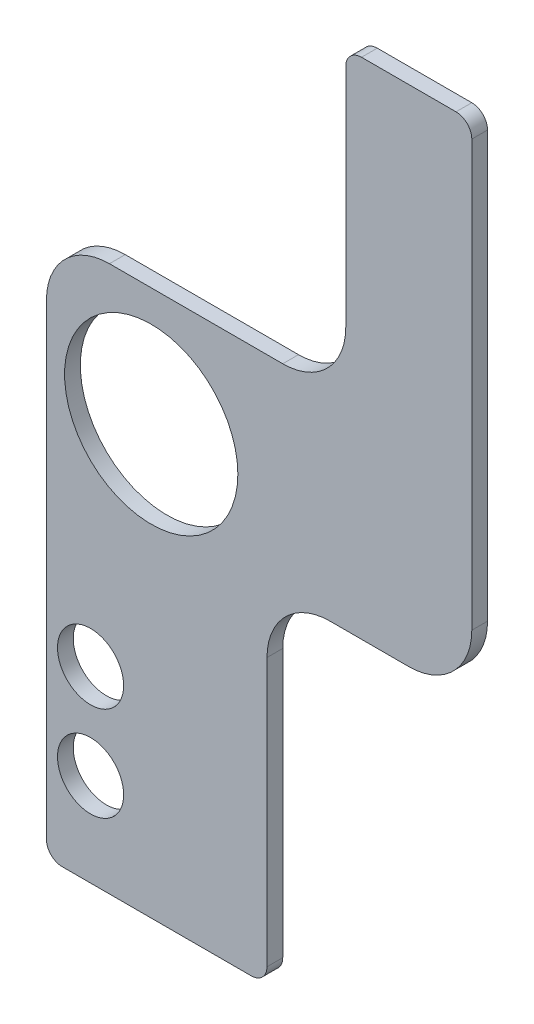
ISO-10303-21;
HEADER;
FILE_DESCRIPTION(('STEP AP214'),'2;1');
FILE_NAME('part.step','',(''),(''),'','','');
FILE_SCHEMA(('AUTOMOTIVE_DESIGN { 1 0 10303 214 1 1 1 1 }'));
ENDSEC;
DATA;
#1=APPLICATION_CONTEXT('core data for automotive mechanical design processes');
#2=APPLICATION_PROTOCOL_DEFINITION('international standard','automotive_design',2000,#1);
#3=PRODUCT_CONTEXT('',#1,'mechanical');
#4=PRODUCT('Part','Part','',(#3));
#5=PRODUCT_RELATED_PRODUCT_CATEGORY('part','',(#4));
#6=PRODUCT_DEFINITION_FORMATION('','',#4);
#7=PRODUCT_DEFINITION_CONTEXT('part definition',#1,'design');
#8=PRODUCT_DEFINITION('design','',#6,#7);
#9=PRODUCT_DEFINITION_SHAPE('','',#8);
#10=(LENGTH_UNIT() NAMED_UNIT(*) SI_UNIT(.MILLI.,.METRE.));
#11=(NAMED_UNIT(*) PLANE_ANGLE_UNIT() SI_UNIT($,.RADIAN.));
#12=(NAMED_UNIT(*) SI_UNIT($,.STERADIAN.) SOLID_ANGLE_UNIT());
#13=UNCERTAINTY_MEASURE_WITH_UNIT(LENGTH_MEASURE(1.E-05),#10,'distance_accuracy_value','');
#14=(GEOMETRIC_REPRESENTATION_CONTEXT(3) GLOBAL_UNCERTAINTY_ASSIGNED_CONTEXT((#13)) GLOBAL_UNIT_ASSIGNED_CONTEXT((#10,
#11,#12)) REPRESENTATION_CONTEXT('',''));
#15=CARTESIAN_POINT('',(0.,0.,0.));
#16=DIRECTION('',(0.,0.,1.));
#17=DIRECTION('',(1.,0.,0.));
#18=AXIS2_PLACEMENT_3D('',#15,#16,#17);
#19=CARTESIAN_POINT('',(9.82320597506649,3.51150326143931,1.));
#20=DIRECTION('',(0.,0.,1.));
#21=DIRECTION('',(1.,0.,0.));
#22=AXIS2_PLACEMENT_3D('',#19,#20,#21);
#23=PLANE('',#22);
#24=CARTESIAN_POINT('',(-10.3767940249335,-10.5884967385607,1.));
#25=DIRECTION('',(0.,0.,1.));
#26=DIRECTION('',(1.,0.,0.));
#27=AXIS2_PLACEMENT_3D('',#24,#25,#26);
#28=CIRCLE('',#27,2.1);
#29=CARTESIAN_POINT('',(-8.2767940249335,-10.5884967385607,1.));
#30=VERTEX_POINT('',#29);
#31=EDGE_CURVE('E344',#30,#30,#28,.T.);
#32=ORIENTED_EDGE('',*,*,#31,.F.);
#33=EDGE_LOOP('',(#32));
#34=FACE_BOUND('',#33,.T.);
#35=CARTESIAN_POINT('',(9.82320597506649,3.51150326143931,1.));
#36=DIRECTION('',(0.,0.,1.));
#37=DIRECTION('',(1.,0.,0.));
#38=AXIS2_PLACEMENT_3D('',#35,#36,#37);
#39=CIRCLE('',#38,4.);
#40=CARTESIAN_POINT('',(9.82320597506649,-0.488496738560686,1.));
#41=VERTEX_POINT('',#40);
#42=CARTESIAN_POINT('',(13.8232059750665,3.51150326143931,1.));
#43=VERTEX_POINT('',#42);
#44=EDGE_CURVE('E215',#41,#43,#39,.T.);
#45=ORIENTED_EDGE('',*,*,#44,.T.);
#46=DIRECTION('',(0.,1.,0.));
#47=VECTOR('',#46,1.);
#48=CARTESIAN_POINT('',(13.8232059750665,3.51150326143931,1.));
#49=LINE('',#48,#47);
#50=CARTESIAN_POINT('',(13.8232059750665,30.5115032614393,1.));
#51=VERTEX_POINT('',#50);
#52=EDGE_CURVE('E123',#43,#51,#49,.T.);
#53=ORIENTED_EDGE('',*,*,#52,.T.);
#54=CARTESIAN_POINT('',(12.8232059750665,30.5115032614393,1.));
#55=DIRECTION('',(0.,0.,1.));
#56=DIRECTION('',(1.,0.,0.));
#57=AXIS2_PLACEMENT_3D('',#54,#55,#56);
#58=CIRCLE('',#57,0.999999999999997);
#59=CARTESIAN_POINT('',(12.8232059750665,31.5115032614393,1.));
#60=VERTEX_POINT('',#59);
#61=EDGE_CURVE('E254',#51,#60,#58,.T.);
#62=ORIENTED_EDGE('',*,*,#61,.T.);
#63=DIRECTION('',(-1.,0.,0.));
#64=VECTOR('',#63,1.);
#65=CARTESIAN_POINT('',(6.82320597506649,31.5115032614393,1.));
#66=LINE('',#65,#64);
#67=CARTESIAN_POINT('',(6.82320597506649,31.5115032614393,1.));
#68=VERTEX_POINT('',#67);
#69=EDGE_CURVE('E273',#60,#68,#66,.T.);
#70=ORIENTED_EDGE('',*,*,#69,.T.);
#71=CARTESIAN_POINT('',(6.82320597506649,30.5115032614393,1.));
#72=DIRECTION('',(0.,0.,1.));
#73=DIRECTION('',(1.,0.,0.));
#74=AXIS2_PLACEMENT_3D('',#71,#72,#73);
#75=CIRCLE('',#74,1.);
#76=CARTESIAN_POINT('',(5.82320597506649,30.5115032614393,1.));
#77=VERTEX_POINT('',#76);
#78=EDGE_CURVE('E270',#68,#77,#75,.T.);
#79=ORIENTED_EDGE('',*,*,#78,.T.);
#80=DIRECTION('',(0.,-1.,0.));
#81=VECTOR('',#80,1.);
#82=CARTESIAN_POINT('',(5.82320597506649,16.1615032614393,1.));
#83=LINE('',#82,#81);
#84=CARTESIAN_POINT('',(5.82320597506649,16.1615032614393,1.));
#85=VERTEX_POINT('',#84);
#86=EDGE_CURVE('E272',#77,#85,#83,.T.);
#87=ORIENTED_EDGE('',*,*,#86,.T.);
#88=CARTESIAN_POINT('',(1.82320597506649,16.1615032614393,1.));
#89=DIRECTION('',(0.,0.,-1.));
#90=DIRECTION('',(-1.,0.,0.));
#91=AXIS2_PLACEMENT_3D('',#88,#89,#90);
#92=CIRCLE('',#91,4.);
#93=CARTESIAN_POINT('',(1.82320597506649,12.1615032614393,1.));
#94=VERTEX_POINT('',#93);
#95=EDGE_CURVE('E275',#85,#94,#92,.T.);
#96=ORIENTED_EDGE('',*,*,#95,.T.);
#97=DIRECTION('',(-1.,0.,0.));
#98=VECTOR('',#97,1.);
#99=CARTESIAN_POINT('',(-9.17679402493351,12.1615032614393,1.));
#100=LINE('',#99,#98);
#101=CARTESIAN_POINT('',(-9.17679402493351,12.1615032614393,1.));
#102=VERTEX_POINT('',#101);
#103=EDGE_CURVE('E281',#94,#102,#100,.T.);
#104=ORIENTED_EDGE('',*,*,#103,.T.);
#105=CARTESIAN_POINT('',(-9.17679402493351,8.16150326143931,1.));
#106=DIRECTION('',(0.,0.,1.));
#107=DIRECTION('',(-1.,0.,0.));
#108=AXIS2_PLACEMENT_3D('',#105,#106,#107);
#109=CIRCLE('',#108,4.);
#110=CARTESIAN_POINT('',(-13.1767940249335,8.16150326143931,1.));
#111=VERTEX_POINT('',#110);
#112=EDGE_CURVE('E283',#102,#111,#109,.T.);
#113=ORIENTED_EDGE('',*,*,#112,.T.);
#114=DIRECTION('',(0.,-1.,0.));
#115=VECTOR('',#114,1.);
#116=CARTESIAN_POINT('',(-13.1767940249335,-21.4884967385607,1.));
#117=LINE('',#116,#115);
#118=CARTESIAN_POINT('',(-13.1767940249335,-21.4884967385607,1.));
#119=VERTEX_POINT('',#118);
#120=EDGE_CURVE('E285',#111,#119,#117,.T.);
#121=ORIENTED_EDGE('',*,*,#120,.T.);
#122=CARTESIAN_POINT('',(-12.1767940249335,-21.4884967385607,1.));
#123=DIRECTION('',(0.,0.,1.));
#124=DIRECTION('',(-1.,0.,0.));
#125=AXIS2_PLACEMENT_3D('',#122,#123,#124);
#126=CIRCLE('',#125,1.);
#127=CARTESIAN_POINT('',(-12.1767940249335,-22.4884967385607,1.));
#128=VERTEX_POINT('',#127);
#129=EDGE_CURVE('E287',#119,#128,#126,.T.);
#130=ORIENTED_EDGE('',*,*,#129,.T.);
#131=DIRECTION('',(1.,0.,0.));
#132=VECTOR('',#131,1.);
#133=CARTESIAN_POINT('',(-12.1767940249335,-22.4884967385607,1.));
#134=LINE('',#133,#132);
#135=CARTESIAN_POINT('',(-0.176794024933504,-22.4884967385607,1.));
#136=VERTEX_POINT('',#135);
#137=EDGE_CURVE('E289',#128,#136,#134,.T.);
#138=ORIENTED_EDGE('',*,*,#137,.T.);
#139=CARTESIAN_POINT('',(-0.176794024933504,-21.4884967385607,1.));
#140=DIRECTION('',(0.,0.,1.));
#141=DIRECTION('',(-1.,0.,0.));
#142=AXIS2_PLACEMENT_3D('',#139,#140,#141);
#143=CIRCLE('',#142,1.);
#144=CARTESIAN_POINT('',(0.823205975066495,-21.4884967385607,1.));
#145=VERTEX_POINT('',#144);
#146=EDGE_CURVE('E166',#136,#145,#143,.T.);
#147=ORIENTED_EDGE('',*,*,#146,.T.);
#148=DIRECTION('',(0.,1.,0.));
#149=VECTOR('',#148,1.);
#150=CARTESIAN_POINT('',(0.823205975066495,-21.4884967385607,1.));
#151=LINE('',#150,#149);
#152=CARTESIAN_POINT('',(0.823205975066495,-4.48849673856069,1.));
#153=VERTEX_POINT('',#152);
#154=EDGE_CURVE('E160',#145,#153,#151,.T.);
#155=ORIENTED_EDGE('',*,*,#154,.T.);
#156=CARTESIAN_POINT('',(4.82320597506649,-4.48849673856069,1.));
#157=DIRECTION('',(0.,0.,-1.));
#158=DIRECTION('',(-1.,0.,0.));
#159=AXIS2_PLACEMENT_3D('',#156,#157,#158);
#160=CIRCLE('',#159,4.);
#161=CARTESIAN_POINT('',(4.82320597506649,-0.488496738560686,1.));
#162=VERTEX_POINT('',#161);
#163=EDGE_CURVE('E164',#153,#162,#160,.T.);
#164=ORIENTED_EDGE('',*,*,#163,.T.);
#165=DIRECTION('',(1.,0.,0.));
#166=VECTOR('',#165,1.);
#167=CARTESIAN_POINT('',(4.82320597506649,-0.488496738560686,1.));
#168=LINE('',#167,#166);
#169=EDGE_CURVE('E56',#162,#41,#168,.T.);
#170=ORIENTED_EDGE('',*,*,#169,.T.);
#171=EDGE_LOOP('',(#45,#53,#62,#70,#79,#87,#96,#104,#113,#121,#130,#138,#147,#155,#164,#170));
#172=FACE_BOUND('',#171,.T.);
#173=CARTESIAN_POINT('',(-10.3767940249335,-16.5884967385607,1.));
#174=DIRECTION('',(0.,0.,1.));
#175=DIRECTION('',(1.,0.,0.));
#176=AXIS2_PLACEMENT_3D('',#173,#174,#175);
#177=CIRCLE('',#176,2.1);
#178=CARTESIAN_POINT('',(-8.2767940249335,-16.5884967385607,1.));
#179=VERTEX_POINT('',#178);
#180=EDGE_CURVE('E188',#179,#179,#177,.T.);
#181=ORIENTED_EDGE('',*,*,#180,.F.);
#182=EDGE_LOOP('',(#181));
#183=FACE_BOUND('',#182,.T.);
#184=CARTESIAN_POINT('',(-6.52679402493351,4.66150326143932,1.));
#185=DIRECTION('',(0.,0.,1.));
#186=DIRECTION('',(1.,0.,0.));
#187=AXIS2_PLACEMENT_3D('',#184,#185,#186);
#188=CIRCLE('',#187,5.5);
#189=CARTESIAN_POINT('',(-1.02679402493351,4.66150326143932,1.));
#190=VERTEX_POINT('',#189);
#191=EDGE_CURVE('E335',#190,#190,#188,.T.);
#192=ORIENTED_EDGE('',*,*,#191,.F.);
#193=EDGE_LOOP('',(#192));
#194=FACE_BOUND('',#193,.T.);
#195=ADVANCED_FACE('F39',(#34,#172,#183,#194),#23,.T.);
#196=CARTESIAN_POINT('',(9.82320597506649,3.51150326143931,0.));
#197=DIRECTION('',(0.,0.,1.));
#198=DIRECTION('',(1.,0.,0.));
#199=AXIS2_PLACEMENT_3D('',#196,#197,#198);
#200=PLANE('',#199);
#201=CARTESIAN_POINT('',(9.82320597506649,3.51150326143931,0.));
#202=DIRECTION('',(0.,0.,1.));
#203=DIRECTION('',(1.,0.,0.));
#204=AXIS2_PLACEMENT_3D('',#201,#202,#203);
#205=CIRCLE('',#204,4.);
#206=CARTESIAN_POINT('',(9.82320597506649,-0.488496738560686,0.));
#207=VERTEX_POINT('',#206);
#208=CARTESIAN_POINT('',(13.8232059750665,3.51150326143931,0.));
#209=VERTEX_POINT('',#208);
#210=EDGE_CURVE('E184',#207,#209,#205,.T.);
#211=ORIENTED_EDGE('',*,*,#210,.F.);
#212=DIRECTION('',(1.,0.,0.));
#213=VECTOR('',#212,1.);
#214=CARTESIAN_POINT('',(4.82320597506649,-0.488496738560686,0.));
#215=LINE('',#214,#213);
#216=CARTESIAN_POINT('',(4.82320597506649,-0.488496738560686,0.));
#217=VERTEX_POINT('',#216);
#218=EDGE_CURVE('E115',#217,#207,#215,.T.);
#219=ORIENTED_EDGE('',*,*,#218,.F.);
#220=CARTESIAN_POINT('',(4.82320597506649,-4.48849673856069,0.));
#221=DIRECTION('',(0.,0.,-1.));
#222=DIRECTION('',(-1.,0.,0.));
#223=AXIS2_PLACEMENT_3D('',#220,#221,#222);
#224=CIRCLE('',#223,4.);
#225=CARTESIAN_POINT('',(0.823205975066495,-4.48849673856069,0.));
#226=VERTEX_POINT('',#225);
#227=EDGE_CURVE('E109',#226,#217,#224,.T.);
#228=ORIENTED_EDGE('',*,*,#227,.F.);
#229=DIRECTION('',(0.,1.,0.));
#230=VECTOR('',#229,1.);
#231=CARTESIAN_POINT('',(0.823205975066495,-21.4884967385607,0.));
#232=LINE('',#231,#230);
#233=CARTESIAN_POINT('',(0.823205975066495,-21.4884967385607,0.));
#234=VERTEX_POINT('',#233);
#235=EDGE_CURVE('E174',#234,#226,#232,.T.);
#236=ORIENTED_EDGE('',*,*,#235,.F.);
#237=CARTESIAN_POINT('',(-0.176794024933504,-21.4884967385607,0.));
#238=DIRECTION('',(0.,0.,1.));
#239=DIRECTION('',(-1.,0.,0.));
#240=AXIS2_PLACEMENT_3D('',#237,#238,#239);
#241=CIRCLE('',#240,1.);
#242=CARTESIAN_POINT('',(-0.176794024933504,-22.4884967385607,0.));
#243=VERTEX_POINT('',#242);
#244=EDGE_CURVE('E210',#243,#234,#241,.T.);
#245=ORIENTED_EDGE('',*,*,#244,.F.);
#246=DIRECTION('',(1.,0.,0.));
#247=VECTOR('',#246,1.);
#248=CARTESIAN_POINT('',(-12.1767940249335,-22.4884967385607,0.));
#249=LINE('',#248,#247);
#250=CARTESIAN_POINT('',(-12.1767940249335,-22.4884967385607,0.));
#251=VERTEX_POINT('',#250);
#252=EDGE_CURVE('E208',#251,#243,#249,.T.);
#253=ORIENTED_EDGE('',*,*,#252,.F.);
#254=CARTESIAN_POINT('',(-12.1767940249335,-21.4884967385607,0.));
#255=DIRECTION('',(0.,0.,1.));
#256=DIRECTION('',(-1.,0.,0.));
#257=AXIS2_PLACEMENT_3D('',#254,#255,#256);
#258=CIRCLE('',#257,1.);
#259=CARTESIAN_POINT('',(-13.1767940249335,-21.4884967385607,0.));
#260=VERTEX_POINT('',#259);
#261=EDGE_CURVE('E206',#260,#251,#258,.T.);
#262=ORIENTED_EDGE('',*,*,#261,.F.);
#263=DIRECTION('',(0.,-1.,0.));
#264=VECTOR('',#263,1.);
#265=CARTESIAN_POINT('',(-13.1767940249335,-21.4884967385607,0.));
#266=LINE('',#265,#264);
#267=CARTESIAN_POINT('',(-13.1767940249335,8.16150326143931,0.));
#268=VERTEX_POINT('',#267);
#269=EDGE_CURVE('E204',#268,#260,#266,.T.);
#270=ORIENTED_EDGE('',*,*,#269,.F.);
#271=CARTESIAN_POINT('',(-9.17679402493351,8.16150326143931,0.));
#272=DIRECTION('',(0.,0.,1.));
#273=DIRECTION('',(-1.,0.,0.));
#274=AXIS2_PLACEMENT_3D('',#271,#272,#273);
#275=CIRCLE('',#274,4.);
#276=CARTESIAN_POINT('',(-9.17679402493351,12.1615032614393,0.));
#277=VERTEX_POINT('',#276);
#278=EDGE_CURVE('E202',#277,#268,#275,.T.);
#279=ORIENTED_EDGE('',*,*,#278,.F.);
#280=DIRECTION('',(-1.,0.,0.));
#281=VECTOR('',#280,1.);
#282=CARTESIAN_POINT('',(-9.17679402493351,12.1615032614393,0.));
#283=LINE('',#282,#281);
#284=CARTESIAN_POINT('',(1.82320597506649,12.1615032614393,0.));
#285=VERTEX_POINT('',#284);
#286=EDGE_CURVE('E200',#285,#277,#283,.T.);
#287=ORIENTED_EDGE('',*,*,#286,.F.);
#288=CARTESIAN_POINT('',(1.82320597506649,16.1615032614393,0.));
#289=DIRECTION('',(0.,0.,-1.));
#290=DIRECTION('',(-1.,0.,0.));
#291=AXIS2_PLACEMENT_3D('',#288,#289,#290);
#292=CIRCLE('',#291,4.);
#293=CARTESIAN_POINT('',(5.82320597506649,16.1615032614393,0.));
#294=VERTEX_POINT('',#293);
#295=EDGE_CURVE('E198',#294,#285,#292,.T.);
#296=ORIENTED_EDGE('',*,*,#295,.F.);
#297=DIRECTION('',(0.,-1.,0.));
#298=VECTOR('',#297,1.);
#299=CARTESIAN_POINT('',(5.82320597506649,16.1615032614393,0.));
#300=LINE('',#299,#298);
#301=CARTESIAN_POINT('',(5.82320597506649,30.5115032614393,0.));
#302=VERTEX_POINT('',#301);
#303=EDGE_CURVE('E196',#302,#294,#300,.T.);
#304=ORIENTED_EDGE('',*,*,#303,.F.);
#305=CARTESIAN_POINT('',(6.82320597506649,30.5115032614393,0.));
#306=DIRECTION('',(0.,0.,1.));
#307=DIRECTION('',(1.,0.,0.));
#308=AXIS2_PLACEMENT_3D('',#305,#306,#307);
#309=CIRCLE('',#308,1.);
#310=CARTESIAN_POINT('',(6.82320597506649,31.5115032614393,0.));
#311=VERTEX_POINT('',#310);
#312=EDGE_CURVE('E194',#311,#302,#309,.T.);
#313=ORIENTED_EDGE('',*,*,#312,.F.);
#314=DIRECTION('',(-1.,0.,0.));
#315=VECTOR('',#314,1.);
#316=CARTESIAN_POINT('',(6.82320597506649,31.5115032614393,0.));
#317=LINE('',#316,#315);
#318=CARTESIAN_POINT('',(12.8232059750665,31.5115032614393,0.));
#319=VERTEX_POINT('',#318);
#320=EDGE_CURVE('E192',#319,#311,#317,.T.);
#321=ORIENTED_EDGE('',*,*,#320,.F.);
#322=CARTESIAN_POINT('',(12.8232059750665,30.5115032614393,0.));
#323=DIRECTION('',(0.,0.,1.));
#324=DIRECTION('',(1.,0.,0.));
#325=AXIS2_PLACEMENT_3D('',#322,#323,#324);
#326=CIRCLE('',#325,0.999999999999997);
#327=CARTESIAN_POINT('',(13.8232059750665,30.5115032614393,0.));
#328=VERTEX_POINT('',#327);
#329=EDGE_CURVE('E190',#328,#319,#326,.T.);
#330=ORIENTED_EDGE('',*,*,#329,.F.);
#331=DIRECTION('',(0.,1.,0.));
#332=VECTOR('',#331,1.);
#333=CARTESIAN_POINT('',(13.8232059750665,3.51150326143931,0.));
#334=LINE('',#333,#332);
#335=EDGE_CURVE('E187',#209,#328,#334,.T.);
#336=ORIENTED_EDGE('',*,*,#335,.F.);
#337=EDGE_LOOP('',(#211,#219,#228,#236,#245,#253,#262,#270,#279,#287,#296,#304,#313,#321,#330,#336));
#338=FACE_BOUND('',#337,.T.);
#339=CARTESIAN_POINT('',(-10.3767940249335,-16.5884967385607,0.));
#340=DIRECTION('',(0.,0.,1.));
#341=DIRECTION('',(1.,0.,0.));
#342=AXIS2_PLACEMENT_3D('',#339,#340,#341);
#343=CIRCLE('',#342,2.1);
#344=CARTESIAN_POINT('',(-8.2767940249335,-16.5884967385607,0.));
#345=VERTEX_POINT('',#344);
#346=EDGE_CURVE('E347',#345,#345,#343,.T.);
#347=ORIENTED_EDGE('',*,*,#346,.T.);
#348=EDGE_LOOP('',(#347));
#349=FACE_BOUND('',#348,.T.);
#350=CARTESIAN_POINT('',(-10.3767940249335,-10.5884967385607,0.));
#351=DIRECTION('',(0.,0.,1.));
#352=DIRECTION('',(1.,0.,0.));
#353=AXIS2_PLACEMENT_3D('',#350,#351,#352);
#354=CIRCLE('',#353,2.1);
#355=CARTESIAN_POINT('',(-8.2767940249335,-10.5884967385607,0.));
#356=VERTEX_POINT('',#355);
#357=EDGE_CURVE('E341',#356,#356,#354,.T.);
#358=ORIENTED_EDGE('',*,*,#357,.T.);
#359=EDGE_LOOP('',(#358));
#360=FACE_BOUND('',#359,.T.);
#361=CARTESIAN_POINT('',(-6.52679402493351,4.66150326143932,0.));
#362=DIRECTION('',(0.,0.,1.));
#363=DIRECTION('',(1.,0.,0.));
#364=AXIS2_PLACEMENT_3D('',#361,#362,#363);
#365=CIRCLE('',#364,5.5);
#366=CARTESIAN_POINT('',(-1.02679402493351,4.66150326143932,0.));
#367=VERTEX_POINT('',#366);
#368=EDGE_CURVE('E338',#367,#367,#365,.T.);
#369=ORIENTED_EDGE('',*,*,#368,.T.);
#370=EDGE_LOOP('',(#369));
#371=FACE_BOUND('',#370,.T.);
#372=ADVANCED_FACE('F258',(#338,#349,#360,#371),#200,.F.);
#373=CARTESIAN_POINT('',(9.82320597506649,3.51150326143931,1.));
#374=DIRECTION('',(0.,0.,-1.));
#375=DIRECTION('',(-1.,0.,0.));
#376=AXIS2_PLACEMENT_3D('',#373,#374,#375);
#377=CYLINDRICAL_SURFACE('',#376,4.);
#378=ORIENTED_EDGE('',*,*,#210,.T.);
#379=DIRECTION('',(0.,0.,-1.));
#380=VECTOR('',#379,1.);
#381=CARTESIAN_POINT('',(13.8232059750665,3.51150326143931,1.));
#382=LINE('',#381,#380);
#383=EDGE_CURVE('E11',#43,#209,#382,.T.);
#384=ORIENTED_EDGE('',*,*,#383,.F.);
#385=ORIENTED_EDGE('',*,*,#44,.F.);
#386=DIRECTION('',(0.,0.,-1.));
#387=VECTOR('',#386,1.);
#388=CARTESIAN_POINT('',(9.82320597506649,-0.488496738560686,1.));
#389=LINE('',#388,#387);
#390=EDGE_CURVE('E180',#41,#207,#389,.T.);
#391=ORIENTED_EDGE('',*,*,#390,.T.);
#392=EDGE_LOOP('',(#378,#384,#385,#391));
#393=FACE_BOUND('',#392,.T.);
#394=ADVANCED_FACE('F41',(#393),#377,.T.);
#395=CARTESIAN_POINT('',(13.8232059750665,3.51150326143931,1.));
#396=DIRECTION('',(-1.,0.,0.));
#397=DIRECTION('',(0.,-1.,0.));
#398=AXIS2_PLACEMENT_3D('',#395,#396,#397);
#399=PLANE('',#398);
#400=ORIENTED_EDGE('',*,*,#335,.T.);
#401=DIRECTION('',(0.,0.,-1.));
#402=VECTOR('',#401,1.);
#403=CARTESIAN_POINT('',(13.8232059750665,30.5115032614393,1.));
#404=LINE('',#403,#402);
#405=EDGE_CURVE('E48',#51,#328,#404,.T.);
#406=ORIENTED_EDGE('',*,*,#405,.F.);
#407=ORIENTED_EDGE('',*,*,#52,.F.);
#408=ORIENTED_EDGE('',*,*,#383,.T.);
#409=EDGE_LOOP('',(#400,#406,#407,#408));
#410=FACE_BOUND('',#409,.T.);
#411=ADVANCED_FACE('F503',(#410),#399,.F.);
#412=CARTESIAN_POINT('',(12.8232059750665,30.5115032614393,1.));
#413=DIRECTION('',(0.,0.,-1.));
#414=DIRECTION('',(-1.,0.,0.));
#415=AXIS2_PLACEMENT_3D('',#412,#413,#414);
#416=CYLINDRICAL_SURFACE('',#415,0.999999999999997);
#417=ORIENTED_EDGE('',*,*,#329,.T.);
#418=DIRECTION('',(0.,0.,-1.));
#419=VECTOR('',#418,1.);
#420=CARTESIAN_POINT('',(12.8232059750665,31.5115032614393,1.));
#421=LINE('',#420,#419);
#422=EDGE_CURVE('E246',#60,#319,#421,.T.);
#423=ORIENTED_EDGE('',*,*,#422,.F.);
#424=ORIENTED_EDGE('',*,*,#61,.F.);
#425=ORIENTED_EDGE('',*,*,#405,.T.);
#426=EDGE_LOOP('',(#417,#423,#424,#425));
#427=FACE_BOUND('',#426,.T.);
#428=ADVANCED_FACE('F252',(#427),#416,.T.);
#429=CARTESIAN_POINT('',(6.82320597506649,31.5115032614393,1.));
#430=DIRECTION('',(0.,-1.,0.));
#431=DIRECTION('',(1.,0.,0.));
#432=AXIS2_PLACEMENT_3D('',#429,#430,#431);
#433=PLANE('',#432);
#434=ORIENTED_EDGE('',*,*,#320,.T.);
#435=DIRECTION('',(0.,0.,-1.));
#436=VECTOR('',#435,1.);
#437=CARTESIAN_POINT('',(6.82320597506649,31.5115032614393,1.));
#438=LINE('',#437,#436);
#439=EDGE_CURVE('E243',#68,#311,#438,.T.);
#440=ORIENTED_EDGE('',*,*,#439,.F.);
#441=ORIENTED_EDGE('',*,*,#69,.F.);
#442=ORIENTED_EDGE('',*,*,#422,.T.);
#443=EDGE_LOOP('',(#434,#440,#441,#442));
#444=FACE_BOUND('',#443,.T.);
#445=ADVANCED_FACE('F264',(#444),#433,.F.);
#446=CARTESIAN_POINT('',(6.82320597506649,30.5115032614393,1.));
#447=DIRECTION('',(0.,0.,-1.));
#448=DIRECTION('',(-1.,0.,0.));
#449=AXIS2_PLACEMENT_3D('',#446,#447,#448);
#450=CYLINDRICAL_SURFACE('',#449,1.);
#451=ORIENTED_EDGE('',*,*,#312,.T.);
#452=DIRECTION('',(0.,0.,-1.));
#453=VECTOR('',#452,1.);
#454=CARTESIAN_POINT('',(5.82320597506649,30.5115032614393,1.));
#455=LINE('',#454,#453);
#456=EDGE_CURVE('E240',#77,#302,#455,.T.);
#457=ORIENTED_EDGE('',*,*,#456,.F.);
#458=ORIENTED_EDGE('',*,*,#78,.F.);
#459=ORIENTED_EDGE('',*,*,#439,.T.);
#460=EDGE_LOOP('',(#451,#457,#458,#459));
#461=FACE_BOUND('',#460,.T.);
#462=ADVANCED_FACE('F268',(#461),#450,.T.);
#463=CARTESIAN_POINT('',(5.82320597506649,16.1615032614393,1.));
#464=DIRECTION('',(1.,0.,0.));
#465=DIRECTION('',(0.,1.,0.));
#466=AXIS2_PLACEMENT_3D('',#463,#464,#465);
#467=PLANE('',#466);
#468=ORIENTED_EDGE('',*,*,#303,.T.);
#469=DIRECTION('',(0.,0.,-1.));
#470=VECTOR('',#469,1.);
#471=CARTESIAN_POINT('',(5.82320597506649,16.1615032614393,1.));
#472=LINE('',#471,#470);
#473=EDGE_CURVE('E237',#85,#294,#472,.T.);
#474=ORIENTED_EDGE('',*,*,#473,.F.);
#475=ORIENTED_EDGE('',*,*,#86,.F.);
#476=ORIENTED_EDGE('',*,*,#456,.T.);
#477=EDGE_LOOP('',(#468,#474,#475,#476));
#478=FACE_BOUND('',#477,.T.);
#479=ADVANCED_FACE('F464',(#478),#467,.F.);
#480=CARTESIAN_POINT('',(1.82320597506649,16.1615032614393,1.));
#481=DIRECTION('',(0.,0.,-1.));
#482=DIRECTION('',(-1.,0.,0.));
#483=AXIS2_PLACEMENT_3D('',#480,#481,#482);
#484=CYLINDRICAL_SURFACE('',#483,4.);
#485=ORIENTED_EDGE('',*,*,#295,.T.);
#486=DIRECTION('',(0.,0.,-1.));
#487=VECTOR('',#486,1.);
#488=CARTESIAN_POINT('',(1.82320597506649,12.1615032614393,1.));
#489=LINE('',#488,#487);
#490=EDGE_CURVE('E234',#94,#285,#489,.T.);
#491=ORIENTED_EDGE('',*,*,#490,.F.);
#492=ORIENTED_EDGE('',*,*,#95,.F.);
#493=ORIENTED_EDGE('',*,*,#473,.T.);
#494=EDGE_LOOP('',(#485,#491,#492,#493));
#495=FACE_BOUND('',#494,.T.);
#496=ADVANCED_FACE('F453',(#495),#484,.F.);
#497=CARTESIAN_POINT('',(-9.17679402493351,12.1615032614393,1.));
#498=DIRECTION('',(0.,-1.,0.));
#499=DIRECTION('',(0.,0.,-1.));
#500=AXIS2_PLACEMENT_3D('',#497,#498,#499);
#501=PLANE('',#500);
#502=ORIENTED_EDGE('',*,*,#286,.T.);
#503=DIRECTION('',(0.,0.,-1.));
#504=VECTOR('',#503,1.);
#505=CARTESIAN_POINT('',(-9.17679402493351,12.1615032614393,1.));
#506=LINE('',#505,#504);
#507=EDGE_CURVE('E231',#102,#277,#506,.T.);
#508=ORIENTED_EDGE('',*,*,#507,.F.);
#509=ORIENTED_EDGE('',*,*,#103,.F.);
#510=ORIENTED_EDGE('',*,*,#490,.T.);
#511=EDGE_LOOP('',(#502,#508,#509,#510));
#512=FACE_BOUND('',#511,.T.);
#513=ADVANCED_FACE('F442',(#512),#501,.F.);
#514=CARTESIAN_POINT('',(-9.17679402493351,8.16150326143931,1.));
#515=DIRECTION('',(0.,0.,-1.));
#516=DIRECTION('',(-1.,0.,0.));
#517=AXIS2_PLACEMENT_3D('',#514,#515,#516);
#518=CYLINDRICAL_SURFACE('',#517,4.);
#519=ORIENTED_EDGE('',*,*,#278,.T.);
#520=DIRECTION('',(0.,0.,-1.));
#521=VECTOR('',#520,1.);
#522=CARTESIAN_POINT('',(-13.1767940249335,8.16150326143931,1.));
#523=LINE('',#522,#521);
#524=EDGE_CURVE('E228',#111,#268,#523,.T.);
#525=ORIENTED_EDGE('',*,*,#524,.F.);
#526=ORIENTED_EDGE('',*,*,#112,.F.);
#527=ORIENTED_EDGE('',*,*,#507,.T.);
#528=EDGE_LOOP('',(#519,#525,#526,#527));
#529=FACE_BOUND('',#528,.T.);
#530=ADVANCED_FACE('F431',(#529),#518,.T.);
#531=CARTESIAN_POINT('',(-13.1767940249335,-21.4884967385607,1.));
#532=DIRECTION('',(1.,0.,0.));
#533=DIRECTION('',(0.,0.,-1.));
#534=AXIS2_PLACEMENT_3D('',#531,#532,#533);
#535=PLANE('',#534);
#536=ORIENTED_EDGE('',*,*,#269,.T.);
#537=DIRECTION('',(0.,0.,-1.));
#538=VECTOR('',#537,1.);
#539=CARTESIAN_POINT('',(-13.1767940249335,-21.4884967385607,1.));
#540=LINE('',#539,#538);
#541=EDGE_CURVE('E225',#119,#260,#540,.T.);
#542=ORIENTED_EDGE('',*,*,#541,.F.);
#543=ORIENTED_EDGE('',*,*,#120,.F.);
#544=ORIENTED_EDGE('',*,*,#524,.T.);
#545=EDGE_LOOP('',(#536,#542,#543,#544));
#546=FACE_BOUND('',#545,.T.);
#547=ADVANCED_FACE('F420',(#546),#535,.F.);
#548=CARTESIAN_POINT('',(-12.1767940249335,-21.4884967385607,1.));
#549=DIRECTION('',(0.,0.,-1.));
#550=DIRECTION('',(-1.,0.,0.));
#551=AXIS2_PLACEMENT_3D('',#548,#549,#550);
#552=CYLINDRICAL_SURFACE('',#551,1.);
#553=ORIENTED_EDGE('',*,*,#261,.T.);
#554=DIRECTION('',(0.,0.,-1.));
#555=VECTOR('',#554,1.);
#556=CARTESIAN_POINT('',(-12.1767940249335,-22.4884967385607,1.));
#557=LINE('',#556,#555);
#558=EDGE_CURVE('E222',#128,#251,#557,.T.);
#559=ORIENTED_EDGE('',*,*,#558,.F.);
#560=ORIENTED_EDGE('',*,*,#129,.F.);
#561=ORIENTED_EDGE('',*,*,#541,.T.);
#562=EDGE_LOOP('',(#553,#559,#560,#561));
#563=FACE_BOUND('',#562,.T.);
#564=ADVANCED_FACE('F410',(#563),#552,.T.);
#565=CARTESIAN_POINT('',(-12.1767940249335,-22.4884967385607,1.));
#566=DIRECTION('',(0.,1.,0.));
#567=DIRECTION('',(0.,0.,1.));
#568=AXIS2_PLACEMENT_3D('',#565,#566,#567);
#569=PLANE('',#568);
#570=ORIENTED_EDGE('',*,*,#252,.T.);
#571=DIRECTION('',(0.,0.,-1.));
#572=VECTOR('',#571,1.);
#573=CARTESIAN_POINT('',(-0.176794024933504,-22.4884967385607,1.));
#574=LINE('',#573,#572);
#575=EDGE_CURVE('E219',#136,#243,#574,.T.);
#576=ORIENTED_EDGE('',*,*,#575,.F.);
#577=ORIENTED_EDGE('',*,*,#137,.F.);
#578=ORIENTED_EDGE('',*,*,#558,.T.);
#579=EDGE_LOOP('',(#570,#576,#577,#578));
#580=FACE_BOUND('',#579,.T.);
#581=ADVANCED_FACE('F295',(#580),#569,.F.);
#582=CARTESIAN_POINT('',(-0.176794024933504,-21.4884967385607,1.));
#583=DIRECTION('',(0.,0.,-1.));
#584=DIRECTION('',(-1.,0.,0.));
#585=AXIS2_PLACEMENT_3D('',#582,#583,#584);
#586=CYLINDRICAL_SURFACE('',#585,1.);
#587=ORIENTED_EDGE('',*,*,#244,.T.);
#588=DIRECTION('',(0.,0.,-1.));
#589=VECTOR('',#588,1.);
#590=CARTESIAN_POINT('',(0.823205975066495,-21.4884967385607,1.));
#591=LINE('',#590,#589);
#592=EDGE_CURVE('E175',#145,#234,#591,.T.);
#593=ORIENTED_EDGE('',*,*,#592,.F.);
#594=ORIENTED_EDGE('',*,*,#146,.F.);
#595=ORIENTED_EDGE('',*,*,#575,.T.);
#596=EDGE_LOOP('',(#587,#593,#594,#595));
#597=FACE_BOUND('',#596,.T.);
#598=ADVANCED_FACE('F299',(#597),#586,.T.);
#599=CARTESIAN_POINT('',(0.823205975066495,-21.4884967385607,1.));
#600=DIRECTION('',(-1.,0.,0.));
#601=DIRECTION('',(0.,0.,1.));
#602=AXIS2_PLACEMENT_3D('',#599,#600,#601);
#603=PLANE('',#602);
#604=ORIENTED_EDGE('',*,*,#235,.T.);
#605=DIRECTION('',(0.,0.,-1.));
#606=VECTOR('',#605,1.);
#607=CARTESIAN_POINT('',(0.823205975066495,-4.48849673856069,1.));
#608=LINE('',#607,#606);
#609=EDGE_CURVE('E171',#153,#226,#608,.T.);
#610=ORIENTED_EDGE('',*,*,#609,.F.);
#611=ORIENTED_EDGE('',*,*,#154,.F.);
#612=ORIENTED_EDGE('',*,*,#592,.T.);
#613=EDGE_LOOP('',(#604,#610,#611,#612));
#614=FACE_BOUND('',#613,.T.);
#615=ADVANCED_FACE('F172',(#614),#603,.F.);
#616=CARTESIAN_POINT('',(4.82320597506649,-4.48849673856069,1.));
#617=DIRECTION('',(0.,0.,-1.));
#618=DIRECTION('',(-1.,0.,0.));
#619=AXIS2_PLACEMENT_3D('',#616,#617,#618);
#620=CYLINDRICAL_SURFACE('',#619,4.);
#621=ORIENTED_EDGE('',*,*,#227,.T.);
#622=DIRECTION('',(0.,0.,-1.));
#623=VECTOR('',#622,1.);
#624=CARTESIAN_POINT('',(4.82320597506649,-0.488496738560686,1.));
#625=LINE('',#624,#623);
#626=EDGE_CURVE('E176',#162,#217,#625,.T.);
#627=ORIENTED_EDGE('',*,*,#626,.F.);
#628=ORIENTED_EDGE('',*,*,#163,.F.);
#629=ORIENTED_EDGE('',*,*,#609,.T.);
#630=EDGE_LOOP('',(#621,#627,#628,#629));
#631=FACE_BOUND('',#630,.T.);
#632=ADVANCED_FACE('F178',(#631),#620,.F.);
#633=CARTESIAN_POINT('',(4.82320597506649,-0.488496738560686,1.));
#634=DIRECTION('',(0.,1.,0.));
#635=DIRECTION('',(0.,0.,1.));
#636=AXIS2_PLACEMENT_3D('',#633,#634,#635);
#637=PLANE('',#636);
#638=ORIENTED_EDGE('',*,*,#218,.T.);
#639=ORIENTED_EDGE('',*,*,#390,.F.);
#640=ORIENTED_EDGE('',*,*,#169,.F.);
#641=ORIENTED_EDGE('',*,*,#626,.T.);
#642=EDGE_LOOP('',(#638,#639,#640,#641));
#643=FACE_BOUND('',#642,.T.);
#644=ADVANCED_FACE('F303',(#643),#637,.F.);
#645=CARTESIAN_POINT('',(-10.3767940249335,-16.5884967385607,1.));
#646=DIRECTION('',(0.,0.,-1.));
#647=DIRECTION('',(-1.,0.,0.));
#648=AXIS2_PLACEMENT_3D('',#645,#646,#647);
#649=CYLINDRICAL_SURFACE('',#648,2.1);
#650=ORIENTED_EDGE('',*,*,#180,.T.);
#651=EDGE_LOOP('',(#650));
#652=FACE_BOUND('',#651,.T.);
#653=ORIENTED_EDGE('',*,*,#346,.F.);
#654=EDGE_LOOP('',(#653));
#655=FACE_BOUND('',#654,.T.);
#656=ADVANCED_FACE('F305',(#652,#655),#649,.F.);
#657=CARTESIAN_POINT('',(-10.3767940249335,-10.5884967385607,1.));
#658=DIRECTION('',(0.,0.,-1.));
#659=DIRECTION('',(-1.,0.,0.));
#660=AXIS2_PLACEMENT_3D('',#657,#658,#659);
#661=CYLINDRICAL_SURFACE('',#660,2.1);
#662=ORIENTED_EDGE('',*,*,#31,.T.);
#663=EDGE_LOOP('',(#662));
#664=FACE_BOUND('',#663,.T.);
#665=ORIENTED_EDGE('',*,*,#357,.F.);
#666=EDGE_LOOP('',(#665));
#667=FACE_BOUND('',#666,.T.);
#668=ADVANCED_FACE('F311',(#664,#667),#661,.F.);
#669=CARTESIAN_POINT('',(-6.52679402493351,4.66150326143932,1.));
#670=DIRECTION('',(0.,0.,-1.));
#671=DIRECTION('',(-1.,0.,0.));
#672=AXIS2_PLACEMENT_3D('',#669,#670,#671);
#673=CYLINDRICAL_SURFACE('',#672,5.5);
#674=ORIENTED_EDGE('',*,*,#191,.T.);
#675=EDGE_LOOP('',(#674));
#676=FACE_BOUND('',#675,.T.);
#677=ORIENTED_EDGE('',*,*,#368,.F.);
#678=EDGE_LOOP('',(#677));
#679=FACE_BOUND('',#678,.T.);
#680=ADVANCED_FACE('F326',(#676,#679),#673,.F.);
#681=CLOSED_SHELL('',(#195,#372,#394,#411,#428,#445,#462,#479,#496,#513,#530,#547,#564,#581,
#598,#615,#632,#644,#656,#668,#680));
#682=MANIFOLD_SOLID_BREP('B2',#681);
#683=ADVANCED_BREP_SHAPE_REPRESENTATION('',(#18,#682),#14);
#684=SHAPE_DEFINITION_REPRESENTATION(#9,#683);
ENDSEC;
END-ISO-10303-21;
